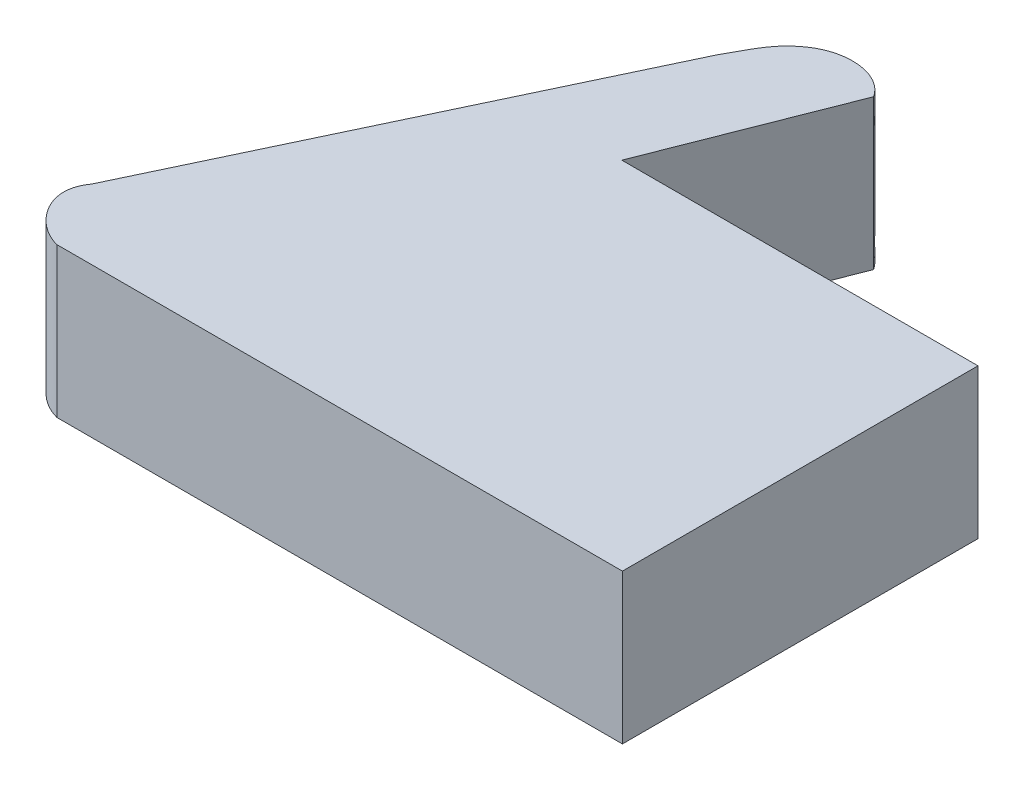
ISO-10303-21;
HEADER;
FILE_DESCRIPTION(('STEP AP214'),'2;1');
FILE_NAME('part.step','',(''),(''),'','','');
FILE_SCHEMA(('AUTOMOTIVE_DESIGN { 1 0 10303 214 1 1 1 1 }'));
ENDSEC;
DATA;
#1=APPLICATION_CONTEXT('core data for automotive mechanical design processes');
#2=APPLICATION_PROTOCOL_DEFINITION('international standard','automotive_design',2000,#1);
#3=PRODUCT_CONTEXT('',#1,'mechanical');
#4=PRODUCT('Part','Part','',(#3));
#5=PRODUCT_RELATED_PRODUCT_CATEGORY('part','',(#4));
#6=PRODUCT_DEFINITION_FORMATION('','',#4);
#7=PRODUCT_DEFINITION_CONTEXT('part definition',#1,'design');
#8=PRODUCT_DEFINITION('design','',#6,#7);
#9=PRODUCT_DEFINITION_SHAPE('','',#8);
#10=(LENGTH_UNIT() NAMED_UNIT(*) SI_UNIT(.MILLI.,.METRE.));
#11=(NAMED_UNIT(*) PLANE_ANGLE_UNIT() SI_UNIT($,.RADIAN.));
#12=(NAMED_UNIT(*) SI_UNIT($,.STERADIAN.) SOLID_ANGLE_UNIT());
#13=UNCERTAINTY_MEASURE_WITH_UNIT(LENGTH_MEASURE(1.E-05),#10,'distance_accuracy_value','');
#14=(GEOMETRIC_REPRESENTATION_CONTEXT(3) GLOBAL_UNCERTAINTY_ASSIGNED_CONTEXT((#13)) GLOBAL_UNIT_ASSIGNED_CONTEXT((#10,
#11,#12)) REPRESENTATION_CONTEXT('',''));
#15=CARTESIAN_POINT('',(0.,0.,0.));
#16=DIRECTION('',(0.,0.,1.));
#17=DIRECTION('',(1.,0.,0.));
#18=AXIS2_PLACEMENT_3D('',#15,#16,#17);
#19=CARTESIAN_POINT('',(-6.57104561622646,28.,-13.0501374991283));
#20=CARTESIAN_POINT('',(-10.4027994030382,28.,-7.92058235879924));
#21=CARTESIAN_POINT('',(-5.18547217661588,28.,-1.28546649906839));
#22=CARTESIAN_POINT('',(0.,28.,0.));
#23=B_SPLINE_CURVE_WITH_KNOTS('',3,(#19,#20,#21,#22),.UNSPECIFIED.,.F.,.F.,(4,4),(0.,1.),.UNSPECIFIED.);
#24=DIRECTION('',(0.,-1.,0.));
#25=VECTOR('',#24,1.);
#26=SURFACE_OF_LINEAR_EXTRUSION('',#23,#25);
#27=CARTESIAN_POINT('',(-6.57104561622646,0.,-13.0501374991283));
#28=CARTESIAN_POINT('',(-10.4027994030382,0.,-7.92058235879924));
#29=CARTESIAN_POINT('',(-5.18547217661588,0.,-1.28546649906839));
#30=CARTESIAN_POINT('',(0.,0.,0.));
#31=B_SPLINE_CURVE_WITH_KNOTS('',3,(#27,#28,#29,#30),.UNSPECIFIED.,.F.,.F.,(4,4),(0.,1.),.UNSPECIFIED.);
#32=CARTESIAN_POINT('',(-6.57104561622646,0.,-13.0501374991283));
#33=VERTEX_POINT('',#32);
#34=CARTESIAN_POINT('',(0.,0.,0.));
#35=VERTEX_POINT('',#34);
#36=EDGE_CURVE('E159',#33,#35,#31,.T.);
#37=ORIENTED_EDGE('',*,*,#36,.T.);
#38=DIRECTION('',(0.,-1.,0.));
#39=VECTOR('',#38,1.);
#40=CARTESIAN_POINT('',(0.,28.,0.));
#41=LINE('',#40,#39);
#42=CARTESIAN_POINT('',(0.,28.,0.));
#43=VERTEX_POINT('',#42);
#44=EDGE_CURVE('E11',#43,#35,#41,.T.);
#45=ORIENTED_EDGE('',*,*,#44,.F.);
#46=CARTESIAN_POINT('',(-6.57104561622646,28.,-13.0501374991283));
#47=VERTEX_POINT('',#46);
#48=EDGE_CURVE('E179',#47,#43,#23,.T.);
#49=ORIENTED_EDGE('',*,*,#48,.F.);
#50=DIRECTION('',(0.,-1.,0.));
#51=VECTOR('',#50,1.);
#52=CARTESIAN_POINT('',(-6.57104561622646,28.,-13.0501374991283));
#53=LINE('',#52,#51);
#54=EDGE_CURVE('E119',#47,#33,#53,.T.);
#55=ORIENTED_EDGE('',*,*,#54,.T.);
#56=EDGE_LOOP('',(#37,#45,#49,#55));
#57=FACE_BOUND('',#56,.T.);
#58=ADVANCED_FACE('F32',(#57),#26,.F.);
#59=CARTESIAN_POINT('',(0.,28.,0.));
#60=DIRECTION('',(0.,0.,-1.));
#61=DIRECTION('',(-1.,0.,0.));
#62=AXIS2_PLACEMENT_3D('',#59,#60,#61);
#63=PLANE('',#62);
#64=DIRECTION('',(1.,0.,0.));
#65=VECTOR('',#64,1.);
#66=CARTESIAN_POINT('',(0.,0.,0.));
#67=LINE('',#66,#65);
#68=CARTESIAN_POINT('',(105.760379503508,0.,0.));
#69=VERTEX_POINT('',#68);
#70=EDGE_CURVE('E150',#35,#69,#67,.T.);
#71=ORIENTED_EDGE('',*,*,#70,.T.);
#72=DIRECTION('',(0.,-1.,0.));
#73=VECTOR('',#72,1.);
#74=CARTESIAN_POINT('',(105.760379503508,28.,0.));
#75=LINE('',#74,#73);
#76=CARTESIAN_POINT('',(105.760379503508,28.,0.));
#77=VERTEX_POINT('',#76);
#78=EDGE_CURVE('E41',#77,#69,#75,.T.);
#79=ORIENTED_EDGE('',*,*,#78,.F.);
#80=DIRECTION('',(1.,0.,0.));
#81=VECTOR('',#80,1.);
#82=CARTESIAN_POINT('',(0.,28.,0.));
#83=LINE('',#82,#81);
#84=EDGE_CURVE('E89',#43,#77,#83,.T.);
#85=ORIENTED_EDGE('',*,*,#84,.F.);
#86=ORIENTED_EDGE('',*,*,#44,.T.);
#87=EDGE_LOOP('',(#71,#79,#85,#86));
#88=FACE_BOUND('',#87,.T.);
#89=ADVANCED_FACE('F143',(#88),#63,.F.);
#90=CARTESIAN_POINT('',(105.760379503508,28.,0.));
#91=DIRECTION('',(-1.,0.,0.));
#92=DIRECTION('',(0.,0.,1.));
#93=AXIS2_PLACEMENT_3D('',#90,#91,#92);
#94=PLANE('',#93);
#95=DIRECTION('',(0.,0.,-1.));
#96=VECTOR('',#95,1.);
#97=CARTESIAN_POINT('',(105.760379503508,0.,0.));
#98=LINE('',#97,#96);
#99=CARTESIAN_POINT('',(105.760379503508,0.,-66.5057601172363));
#100=VERTEX_POINT('',#99);
#101=EDGE_CURVE('E158',#69,#100,#98,.T.);
#102=ORIENTED_EDGE('',*,*,#101,.T.);
#103=DIRECTION('',(0.,-1.,0.));
#104=VECTOR('',#103,1.);
#105=CARTESIAN_POINT('',(105.760379503508,28.,-66.5057601172363));
#106=LINE('',#105,#104);
#107=CARTESIAN_POINT('',(105.760379503508,28.,-66.5057601172363));
#108=VERTEX_POINT('',#107);
#109=EDGE_CURVE('E164',#108,#100,#106,.T.);
#110=ORIENTED_EDGE('',*,*,#109,.F.);
#111=DIRECTION('',(0.,0.,-1.));
#112=VECTOR('',#111,1.);
#113=CARTESIAN_POINT('',(105.760379503508,28.,0.));
#114=LINE('',#113,#112);
#115=EDGE_CURVE('E163',#77,#108,#114,.T.);
#116=ORIENTED_EDGE('',*,*,#115,.F.);
#117=ORIENTED_EDGE('',*,*,#78,.T.);
#118=EDGE_LOOP('',(#102,#110,#116,#117));
#119=FACE_BOUND('',#118,.T.);
#120=ADVANCED_FACE('F140',(#119),#94,.F.);
#121=CARTESIAN_POINT('',(105.760379503508,28.,-66.5057601172363));
#122=DIRECTION('',(0.,0.,1.));
#123=DIRECTION('',(1.,0.,0.));
#124=AXIS2_PLACEMENT_3D('',#121,#122,#123);
#125=PLANE('',#124);
#126=DIRECTION('',(-1.,0.,0.));
#127=VECTOR('',#126,1.);
#128=CARTESIAN_POINT('',(105.760379503508,0.,-66.5057601172363));
#129=LINE('',#128,#127);
#130=CARTESIAN_POINT('',(39.1464799389261,0.,-66.5057601172363));
#131=VERTEX_POINT('',#130);
#132=EDGE_CURVE('E167',#100,#131,#129,.T.);
#133=ORIENTED_EDGE('',*,*,#132,.T.);
#134=DIRECTION('',(0.,-1.,0.));
#135=VECTOR('',#134,1.);
#136=CARTESIAN_POINT('',(39.1464799389261,28.,-66.5057601172363));
#137=LINE('',#136,#135);
#138=CARTESIAN_POINT('',(39.1464799389261,28.,-66.5057601172363));
#139=VERTEX_POINT('',#138);
#140=EDGE_CURVE('E114',#139,#131,#137,.T.);
#141=ORIENTED_EDGE('',*,*,#140,.F.);
#142=DIRECTION('',(-1.,0.,0.));
#143=VECTOR('',#142,1.);
#144=CARTESIAN_POINT('',(105.760379503508,28.,-66.5057601172363));
#145=LINE('',#144,#143);
#146=EDGE_CURVE('E105',#108,#139,#145,.T.);
#147=ORIENTED_EDGE('',*,*,#146,.F.);
#148=ORIENTED_EDGE('',*,*,#109,.T.);
#149=EDGE_LOOP('',(#133,#141,#147,#148));
#150=FACE_BOUND('',#149,.T.);
#151=ADVANCED_FACE('F137',(#150),#125,.F.);
#152=CARTESIAN_POINT('',(39.1464799389261,28.,-66.5057601172363));
#153=DIRECTION('',(-0.93090556432755,0.,-0.36525994894596));
#154=DIRECTION('',(-0.36525994894596,0.,0.93090556432755));
#155=AXIS2_PLACEMENT_3D('',#152,#153,#154);
#156=PLANE('',#155);
#157=DIRECTION('',(0.36525994894596,0.,-0.93090556432755));
#158=VECTOR('',#157,1.);
#159=CARTESIAN_POINT('',(39.1464799389261,0.,-66.5057601172363));
#160=LINE('',#159,#158);
#161=CARTESIAN_POINT('',(52.4157364551813,0.,-100.323934710748));
#162=VERTEX_POINT('',#161);
#163=EDGE_CURVE('E113',#131,#162,#160,.T.);
#164=ORIENTED_EDGE('',*,*,#163,.T.);
#165=DIRECTION('',(0.,-1.,0.));
#166=VECTOR('',#165,1.);
#167=CARTESIAN_POINT('',(52.4157364551813,28.,-100.323934710748));
#168=LINE('',#167,#166);
#169=CARTESIAN_POINT('',(52.4157364551813,28.,-100.323934710748));
#170=VERTEX_POINT('',#169);
#171=EDGE_CURVE('E110',#170,#162,#168,.T.);
#172=ORIENTED_EDGE('',*,*,#171,.F.);
#173=DIRECTION('',(0.36525994894596,0.,-0.93090556432755));
#174=VECTOR('',#173,1.);
#175=CARTESIAN_POINT('',(39.1464799389261,28.,-66.5057601172363));
#176=LINE('',#175,#174);
#177=EDGE_CURVE('E99',#139,#170,#176,.T.);
#178=ORIENTED_EDGE('',*,*,#177,.F.);
#179=ORIENTED_EDGE('',*,*,#140,.T.);
#180=EDGE_LOOP('',(#164,#172,#178,#179));
#181=FACE_BOUND('',#180,.T.);
#182=ADVANCED_FACE('F111',(#181),#156,.F.);
#183=CARTESIAN_POINT('',(52.4157364551813,28.,-100.323934710748));
#184=CARTESIAN_POINT('',(50.0771387101782,28.,-103.942471785045));
#185=CARTESIAN_POINT('',(41.8975562317505,28.,-105.53646995468));
#186=CARTESIAN_POINT('',(34.2801333551096,28.,-99.2942755722194));
#187=CARTESIAN_POINT('',(32.2285678216752,28.,-94.5667923020325));
#188=CARTESIAN_POINT('',(30.9726362212412,28.,-92.44700269522));
#189=B_SPLINE_CURVE_WITH_KNOTS('',3,(#183,#184,#185,#186,#187,#188),.UNSPECIFIED.,.F.,.F.,(4,1,
1,4),(0.,0.447115865193849,0.733607521513686,1.),.UNSPECIFIED.);
#190=DIRECTION('',(0.,-1.,0.));
#191=VECTOR('',#190,1.);
#192=SURFACE_OF_LINEAR_EXTRUSION('',#189,#191);
#193=CARTESIAN_POINT('',(52.4157364551813,0.,-100.323934710748));
#194=CARTESIAN_POINT('',(50.0771387101782,0.,-103.942471785045));
#195=CARTESIAN_POINT('',(41.8975562317505,0.,-105.53646995468));
#196=CARTESIAN_POINT('',(34.2801333551096,0.,-99.2942755722194));
#197=CARTESIAN_POINT('',(32.2285678216752,0.,-94.5667923020325));
#198=CARTESIAN_POINT('',(30.9726362212412,0.,-92.44700269522));
#199=B_SPLINE_CURVE_WITH_KNOTS('',3,(#193,#194,#195,#196,#197,#198),.UNSPECIFIED.,.F.,.F.,(4,1,
1,4),(0.,0.447115865193849,0.733607521513686,1.),.UNSPECIFIED.);
#200=CARTESIAN_POINT('',(30.9726362212412,0.,-92.44700269522));
#201=VERTEX_POINT('',#200);
#202=EDGE_CURVE('E75',#162,#201,#199,.T.);
#203=ORIENTED_EDGE('',*,*,#202,.T.);
#204=DIRECTION('',(0.,-1.,0.));
#205=VECTOR('',#204,1.);
#206=CARTESIAN_POINT('',(30.9726362212412,28.,-92.44700269522));
#207=LINE('',#206,#205);
#208=CARTESIAN_POINT('',(30.9726362212412,28.,-92.44700269522));
#209=VERTEX_POINT('',#208);
#210=EDGE_CURVE('E115',#209,#201,#207,.T.);
#211=ORIENTED_EDGE('',*,*,#210,.F.);
#212=EDGE_CURVE('E103',#170,#209,#189,.T.);
#213=ORIENTED_EDGE('',*,*,#212,.F.);
#214=ORIENTED_EDGE('',*,*,#171,.T.);
#215=EDGE_LOOP('',(#203,#211,#213,#214));
#216=FACE_BOUND('',#215,.T.);
#217=ADVANCED_FACE('F117',(#216),#192,.F.);
#218=CARTESIAN_POINT('',(30.9726362212412,28.,-92.44700269522));
#219=DIRECTION('',(0.904025546907282,0.,0.427478432834908));
#220=DIRECTION('',(0.427478432834908,0.,-0.904025546907282));
#221=AXIS2_PLACEMENT_3D('',#218,#219,#220);
#222=PLANE('',#221);
#223=DIRECTION('',(-0.427478432834908,0.,0.904025546907282));
#224=VECTOR('',#223,1.);
#225=CARTESIAN_POINT('',(30.9726362212412,0.,-92.44700269522));
#226=LINE('',#225,#224);
#227=EDGE_CURVE('E81',#201,#33,#226,.T.);
#228=ORIENTED_EDGE('',*,*,#227,.T.);
#229=ORIENTED_EDGE('',*,*,#54,.F.);
#230=DIRECTION('',(-0.427478432834908,0.,0.904025546907282));
#231=VECTOR('',#230,1.);
#232=CARTESIAN_POINT('',(30.9726362212412,28.,-92.44700269522));
#233=LINE('',#232,#231);
#234=EDGE_CURVE('E49',#209,#47,#233,.T.);
#235=ORIENTED_EDGE('',*,*,#234,.F.);
#236=ORIENTED_EDGE('',*,*,#210,.T.);
#237=EDGE_LOOP('',(#228,#229,#235,#236));
#238=FACE_BOUND('',#237,.T.);
#239=ADVANCED_FACE('F133',(#238),#222,.F.);
#240=CARTESIAN_POINT('',(-6.66698254439858,28.,-5.0835355090914));
#241=DIRECTION('',(0.,-1.,0.));
#242=DIRECTION('',(0.,0.,-1.));
#243=AXIS2_PLACEMENT_3D('',#240,#241,#242);
#244=PLANE('',#243);
#245=ORIENTED_EDGE('',*,*,#48,.T.);
#246=ORIENTED_EDGE('',*,*,#84,.T.);
#247=ORIENTED_EDGE('',*,*,#115,.T.);
#248=ORIENTED_EDGE('',*,*,#146,.T.);
#249=ORIENTED_EDGE('',*,*,#177,.T.);
#250=ORIENTED_EDGE('',*,*,#212,.T.);
#251=ORIENTED_EDGE('',*,*,#234,.T.);
#252=EDGE_LOOP('',(#245,#246,#247,#248,#249,#250,#251));
#253=FACE_BOUND('',#252,.T.);
#254=ADVANCED_FACE('F101',(#253),#244,.F.);
#255=CARTESIAN_POINT('',(-6.66698254439858,0.,-5.0835355090914));
#256=DIRECTION('',(0.,-1.,0.));
#257=DIRECTION('',(0.,0.,-1.));
#258=AXIS2_PLACEMENT_3D('',#255,#256,#257);
#259=PLANE('',#258);
#260=ORIENTED_EDGE('',*,*,#36,.F.);
#261=ORIENTED_EDGE('',*,*,#227,.F.);
#262=ORIENTED_EDGE('',*,*,#202,.F.);
#263=ORIENTED_EDGE('',*,*,#163,.F.);
#264=ORIENTED_EDGE('',*,*,#132,.F.);
#265=ORIENTED_EDGE('',*,*,#101,.F.);
#266=ORIENTED_EDGE('',*,*,#70,.F.);
#267=EDGE_LOOP('',(#260,#261,#262,#263,#264,#265,#266));
#268=FACE_BOUND('',#267,.T.);
#269=ADVANCED_FACE('F166',(#268),#259,.T.);
#270=CLOSED_SHELL('',(#58,#89,#120,#151,#182,#217,#239,#254,#269));
#271=MANIFOLD_SOLID_BREP('B2',#270);
#272=ADVANCED_BREP_SHAPE_REPRESENTATION('',(#18,#271),#14);
#273=SHAPE_DEFINITION_REPRESENTATION(#9,#272);
ENDSEC;
END-ISO-10303-21;
